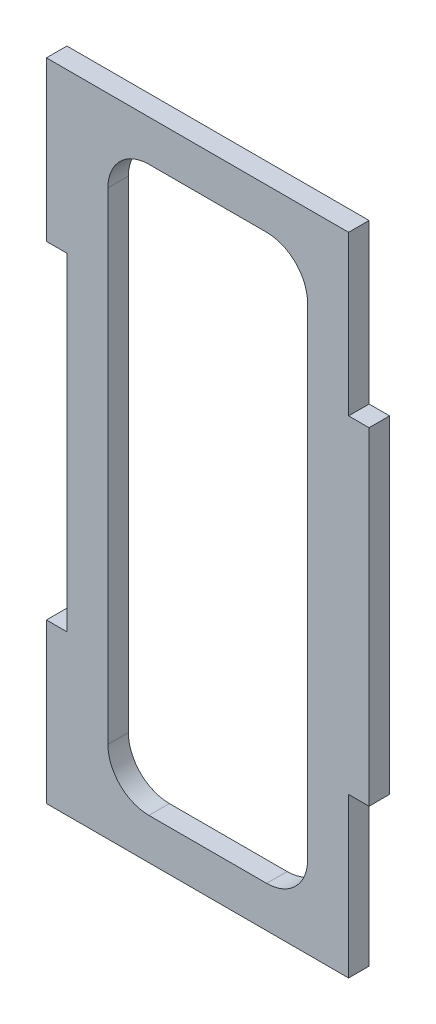
ISO-10303-21;
HEADER;
FILE_DESCRIPTION(('STEP AP214'),'2;1');
FILE_NAME('part.step','',(''),(''),'','','');
FILE_SCHEMA(('AUTOMOTIVE_DESIGN { 1 0 10303 214 1 1 1 1 }'));
ENDSEC;
DATA;
#1=APPLICATION_CONTEXT('core data for automotive mechanical design processes');
#2=APPLICATION_PROTOCOL_DEFINITION('international standard','automotive_design',2000,#1);
#3=PRODUCT_CONTEXT('',#1,'mechanical');
#4=PRODUCT('Part','Part','',(#3));
#5=PRODUCT_RELATED_PRODUCT_CATEGORY('part','',(#4));
#6=PRODUCT_DEFINITION_FORMATION('','',#4);
#7=PRODUCT_DEFINITION_CONTEXT('part definition',#1,'design');
#8=PRODUCT_DEFINITION('design','',#6,#7);
#9=PRODUCT_DEFINITION_SHAPE('','',#8);
#10=(LENGTH_UNIT() NAMED_UNIT(*) SI_UNIT(.MILLI.,.METRE.));
#11=(NAMED_UNIT(*) PLANE_ANGLE_UNIT() SI_UNIT($,.RADIAN.));
#12=(NAMED_UNIT(*) SI_UNIT($,.STERADIAN.) SOLID_ANGLE_UNIT());
#13=UNCERTAINTY_MEASURE_WITH_UNIT(LENGTH_MEASURE(1.E-05),#10,'distance_accuracy_value','');
#14=(GEOMETRIC_REPRESENTATION_CONTEXT(3) GLOBAL_UNCERTAINTY_ASSIGNED_CONTEXT((#13)) GLOBAL_UNIT_ASSIGNED_CONTEXT((#10,
#11,#12)) REPRESENTATION_CONTEXT('',''));
#15=CARTESIAN_POINT('',(0.,0.,0.));
#16=DIRECTION('',(0.,0.,1.));
#17=DIRECTION('',(1.,0.,0.));
#18=AXIS2_PLACEMENT_3D('',#15,#16,#17);
#19=CARTESIAN_POINT('',(0.,0.,6.35));
#20=DIRECTION('',(0.,0.,-1.));
#21=DIRECTION('',(-1.,0.,0.));
#22=AXIS2_PLACEMENT_3D('',#19,#20,#21);
#23=PLANE('',#22);
#24=DIRECTION('',(1.,0.,0.));
#25=VECTOR('',#24,1.);
#26=CARTESIAN_POINT('',(-30.95,-137.4518,6.35));
#27=LINE('',#26,#25);
#28=CARTESIAN_POINT('',(-18.25,-137.4518,6.35));
#29=VERTEX_POINT('',#28);
#30=CARTESIAN_POINT('',(18.25,-137.4518,6.35));
#31=VERTEX_POINT('',#30);
#32=EDGE_CURVE('E310',#29,#31,#27,.T.);
#33=ORIENTED_EDGE('',*,*,#32,.F.);
#34=CARTESIAN_POINT('',(-18.25,-124.7518,6.35));
#35=DIRECTION('',(0.,0.,-1.));
#36=DIRECTION('',(-1.,0.,0.));
#37=AXIS2_PLACEMENT_3D('',#34,#35,#36);
#38=CIRCLE('',#37,12.7);
#39=CARTESIAN_POINT('',(-30.95,-124.7518,6.35));
#40=VERTEX_POINT('',#39);
#41=EDGE_CURVE('E40',#29,#40,#38,.T.);
#42=ORIENTED_EDGE('',*,*,#41,.T.);
#43=DIRECTION('',(0.,-1.,0.));
#44=VECTOR('',#43,1.);
#45=CARTESIAN_POINT('',(-30.95,-137.4518,6.35));
#46=LINE('',#45,#44);
#47=CARTESIAN_POINT('',(-30.95,24.6,6.35));
#48=VERTEX_POINT('',#47);
#49=EDGE_CURVE('E308',#48,#40,#46,.T.);
#50=ORIENTED_EDGE('',*,*,#49,.F.);
#51=CARTESIAN_POINT('',(-18.25,24.6,6.35));
#52=DIRECTION('',(0.,0.,-1.));
#53=DIRECTION('',(-1.,0.,0.));
#54=AXIS2_PLACEMENT_3D('',#51,#52,#53);
#55=CIRCLE('',#54,12.7);
#56=CARTESIAN_POINT('',(-18.25,37.3,6.35));
#57=VERTEX_POINT('',#56);
#58=EDGE_CURVE('E302',#48,#57,#55,.T.);
#59=ORIENTED_EDGE('',*,*,#58,.T.);
#60=DIRECTION('',(-1.,0.,0.));
#61=VECTOR('',#60,1.);
#62=CARTESIAN_POINT('',(-30.95,37.3,6.35));
#63=LINE('',#62,#61);
#64=CARTESIAN_POINT('',(18.25,37.3,6.35));
#65=VERTEX_POINT('',#64);
#66=EDGE_CURVE('E197',#65,#57,#63,.T.);
#67=ORIENTED_EDGE('',*,*,#66,.F.);
#68=CARTESIAN_POINT('',(18.25,24.6,6.35));
#69=DIRECTION('',(0.,0.,-1.));
#70=DIRECTION('',(-1.,0.,0.));
#71=AXIS2_PLACEMENT_3D('',#68,#69,#70);
#72=CIRCLE('',#71,12.7);
#73=CARTESIAN_POINT('',(30.9499999999999,24.6,6.35));
#74=VERTEX_POINT('',#73);
#75=EDGE_CURVE('E298',#65,#74,#72,.T.);
#76=ORIENTED_EDGE('',*,*,#75,.T.);
#77=DIRECTION('',(0.,1.,0.));
#78=VECTOR('',#77,1.);
#79=CARTESIAN_POINT('',(30.9499999999999,-137.4518,6.35));
#80=LINE('',#79,#78);
#81=CARTESIAN_POINT('',(30.9499999999999,-124.7518,6.35));
#82=VERTEX_POINT('',#81);
#83=EDGE_CURVE('E332',#82,#74,#80,.T.);
#84=ORIENTED_EDGE('',*,*,#83,.F.);
#85=CARTESIAN_POINT('',(18.25,-124.7518,6.35));
#86=DIRECTION('',(0.,0.,-1.));
#87=DIRECTION('',(-1.,0.,0.));
#88=AXIS2_PLACEMENT_3D('',#85,#86,#87);
#89=CIRCLE('',#88,12.7);
#90=EDGE_CURVE('E294',#82,#31,#89,.T.);
#91=ORIENTED_EDGE('',*,*,#90,.T.);
#92=EDGE_LOOP('',(#33,#42,#50,#59,#67,#76,#84,#91));
#93=FACE_BOUND('',#92,.T.);
#94=DIRECTION('',(1.,0.,0.));
#95=VECTOR('',#94,1.);
#96=CARTESIAN_POINT('',(0.,-100.8759,6.35));
#97=LINE('',#96,#95);
#98=CARTESIAN_POINT('',(43.65,-100.8759,6.35));
#99=VERTEX_POINT('',#98);
#100=CARTESIAN_POINT('',(50.,-100.8759,6.35));
#101=VERTEX_POINT('',#100);
#102=EDGE_CURVE('E186',#99,#101,#97,.T.);
#103=ORIENTED_EDGE('',*,*,#102,.T.);
#104=DIRECTION('',(0.,1.,0.));
#105=VECTOR('',#104,1.);
#106=CARTESIAN_POINT('',(50.,-150.1518,6.35));
#107=LINE('',#106,#105);
#108=CARTESIAN_POINT('',(50.,0.724099999999998,6.35));
#109=VERTEX_POINT('',#108);
#110=EDGE_CURVE('E257',#101,#109,#107,.T.);
#111=ORIENTED_EDGE('',*,*,#110,.T.);
#112=DIRECTION('',(1.,0.,0.));
#113=VECTOR('',#112,1.);
#114=CARTESIAN_POINT('',(0.,0.724099999999998,6.35));
#115=LINE('',#114,#113);
#116=CARTESIAN_POINT('',(43.65,0.724099999999998,6.35));
#117=VERTEX_POINT('',#116);
#118=EDGE_CURVE('E210',#117,#109,#115,.T.);
#119=ORIENTED_EDGE('',*,*,#118,.F.);
#120=DIRECTION('',(0.,-1.,0.));
#121=VECTOR('',#120,1.);
#122=CARTESIAN_POINT('',(43.65,0.,6.35));
#123=LINE('',#122,#121);
#124=CARTESIAN_POINT('',(43.65,50.,6.35));
#125=VERTEX_POINT('',#124);
#126=EDGE_CURVE('E204',#125,#117,#123,.T.);
#127=ORIENTED_EDGE('',*,*,#126,.F.);
#128=DIRECTION('',(-1.,0.,0.));
#129=VECTOR('',#128,1.);
#130=CARTESIAN_POINT('',(-50.,50.,6.35));
#131=LINE('',#130,#129);
#132=CARTESIAN_POINT('',(-50.,50.,6.35));
#133=VERTEX_POINT('',#132);
#134=EDGE_CURVE('E259',#125,#133,#131,.T.);
#135=ORIENTED_EDGE('',*,*,#134,.T.);
#136=DIRECTION('',(0.,-1.,0.));
#137=VECTOR('',#136,1.);
#138=CARTESIAN_POINT('',(-50.,-150.1518,6.35));
#139=LINE('',#138,#137);
#140=CARTESIAN_POINT('',(-50.,0.724100000000005,6.35));
#141=VERTEX_POINT('',#140);
#142=EDGE_CURVE('E250',#133,#141,#139,.T.);
#143=ORIENTED_EDGE('',*,*,#142,.T.);
#144=DIRECTION('',(1.,0.,0.));
#145=VECTOR('',#144,1.);
#146=CARTESIAN_POINT('',(0.,0.724100000000005,6.35));
#147=LINE('',#146,#145);
#148=CARTESIAN_POINT('',(-43.65,0.724100000000005,6.35));
#149=VERTEX_POINT('',#148);
#150=EDGE_CURVE('E228',#141,#149,#147,.T.);
#151=ORIENTED_EDGE('',*,*,#150,.T.);
#152=DIRECTION('',(0.,1.,0.));
#153=VECTOR('',#152,1.);
#154=CARTESIAN_POINT('',(-43.65,0.,6.35));
#155=LINE('',#154,#153);
#156=CARTESIAN_POINT('',(-43.65,-100.8759,6.35));
#157=VERTEX_POINT('',#156);
#158=EDGE_CURVE('E236',#157,#149,#155,.T.);
#159=ORIENTED_EDGE('',*,*,#158,.F.);
#160=DIRECTION('',(1.,0.,0.));
#161=VECTOR('',#160,1.);
#162=CARTESIAN_POINT('',(0.,-100.8759,6.35));
#163=LINE('',#162,#161);
#164=CARTESIAN_POINT('',(-50.,-100.8759,6.35));
#165=VERTEX_POINT('',#164);
#166=EDGE_CURVE('E219',#165,#157,#163,.T.);
#167=ORIENTED_EDGE('',*,*,#166,.F.);
#168=CARTESIAN_POINT('',(-50.,-150.1518,6.35));
#169=VERTEX_POINT('',#168);
#170=EDGE_CURVE('E254',#165,#169,#139,.T.);
#171=ORIENTED_EDGE('',*,*,#170,.T.);
#172=DIRECTION('',(1.,0.,0.));
#173=VECTOR('',#172,1.);
#174=CARTESIAN_POINT('',(-50.,-150.1518,6.35));
#175=LINE('',#174,#173);
#176=CARTESIAN_POINT('',(43.65,-150.1518,6.35));
#177=VERTEX_POINT('',#176);
#178=EDGE_CURVE('E253',#169,#177,#175,.T.);
#179=ORIENTED_EDGE('',*,*,#178,.T.);
#180=DIRECTION('',(0.,1.,0.));
#181=VECTOR('',#180,1.);
#182=CARTESIAN_POINT('',(43.65,0.,6.35));
#183=LINE('',#182,#181);
#184=EDGE_CURVE('E193',#177,#99,#183,.T.);
#185=ORIENTED_EDGE('',*,*,#184,.T.);
#186=EDGE_LOOP('',(#103,#111,#119,#127,#135,#143,#151,#159,#167,#171,#179,#185));
#187=FACE_BOUND('',#186,.T.);
#188=ADVANCED_FACE('F32',(#93,#187),#23,.F.);
#189=CARTESIAN_POINT('',(0.,0.,0.));
#190=DIRECTION('',(0.,0.,-1.));
#191=DIRECTION('',(-1.,0.,0.));
#192=AXIS2_PLACEMENT_3D('',#189,#190,#191);
#193=PLANE('',#192);
#194=DIRECTION('',(-1.,0.,0.));
#195=VECTOR('',#194,1.);
#196=CARTESIAN_POINT('',(-30.95,37.3,0.));
#197=LINE('',#196,#195);
#198=CARTESIAN_POINT('',(18.25,37.3,0.));
#199=VERTEX_POINT('',#198);
#200=CARTESIAN_POINT('',(-18.25,37.3,0.));
#201=VERTEX_POINT('',#200);
#202=EDGE_CURVE('E200',#199,#201,#197,.T.);
#203=ORIENTED_EDGE('',*,*,#202,.T.);
#204=CARTESIAN_POINT('',(-18.25,24.6,0.));
#205=DIRECTION('',(0.,0.,-1.));
#206=DIRECTION('',(-1.,0.,0.));
#207=AXIS2_PLACEMENT_3D('',#204,#205,#206);
#208=CIRCLE('',#207,12.7);
#209=CARTESIAN_POINT('',(-30.95,24.6,0.));
#210=VERTEX_POINT('',#209);
#211=EDGE_CURVE('E54',#201,#210,#208,.F.);
#212=ORIENTED_EDGE('',*,*,#211,.T.);
#213=DIRECTION('',(0.,-1.,0.));
#214=VECTOR('',#213,1.);
#215=CARTESIAN_POINT('',(-30.95,-137.4518,0.));
#216=LINE('',#215,#214);
#217=CARTESIAN_POINT('',(-30.95,-124.7518,0.));
#218=VERTEX_POINT('',#217);
#219=EDGE_CURVE('E321',#210,#218,#216,.T.);
#220=ORIENTED_EDGE('',*,*,#219,.T.);
#221=CARTESIAN_POINT('',(-18.25,-124.7518,0.));
#222=DIRECTION('',(0.,0.,-1.));
#223=DIRECTION('',(-1.,0.,0.));
#224=AXIS2_PLACEMENT_3D('',#221,#222,#223);
#225=CIRCLE('',#224,12.7);
#226=CARTESIAN_POINT('',(-18.25,-137.4518,0.));
#227=VERTEX_POINT('',#226);
#228=EDGE_CURVE('E11',#218,#227,#225,.F.);
#229=ORIENTED_EDGE('',*,*,#228,.T.);
#230=DIRECTION('',(1.,0.,0.));
#231=VECTOR('',#230,1.);
#232=CARTESIAN_POINT('',(-30.95,-137.4518,0.));
#233=LINE('',#232,#231);
#234=CARTESIAN_POINT('',(18.25,-137.4518,0.));
#235=VERTEX_POINT('',#234);
#236=EDGE_CURVE('E319',#227,#235,#233,.T.);
#237=ORIENTED_EDGE('',*,*,#236,.T.);
#238=CARTESIAN_POINT('',(18.25,-124.7518,0.));
#239=DIRECTION('',(0.,0.,-1.));
#240=DIRECTION('',(-1.,0.,0.));
#241=AXIS2_PLACEMENT_3D('',#238,#239,#240);
#242=CIRCLE('',#241,12.7);
#243=CARTESIAN_POINT('',(30.9499999999999,-124.7518,0.));
#244=VERTEX_POINT('',#243);
#245=EDGE_CURVE('E296',#235,#244,#242,.F.);
#246=ORIENTED_EDGE('',*,*,#245,.T.);
#247=DIRECTION('',(0.,1.,0.));
#248=VECTOR('',#247,1.);
#249=CARTESIAN_POINT('',(30.9499999999999,-137.4518,0.));
#250=LINE('',#249,#248);
#251=CARTESIAN_POINT('',(30.9499999999999,24.6,0.));
#252=VERTEX_POINT('',#251);
#253=EDGE_CURVE('E325',#244,#252,#250,.T.);
#254=ORIENTED_EDGE('',*,*,#253,.T.);
#255=CARTESIAN_POINT('',(18.25,24.6,0.));
#256=DIRECTION('',(0.,0.,-1.));
#257=DIRECTION('',(-1.,0.,0.));
#258=AXIS2_PLACEMENT_3D('',#255,#256,#257);
#259=CIRCLE('',#258,12.7);
#260=EDGE_CURVE('E300',#252,#199,#259,.F.);
#261=ORIENTED_EDGE('',*,*,#260,.T.);
#262=EDGE_LOOP('',(#203,#212,#220,#229,#237,#246,#254,#261));
#263=FACE_BOUND('',#262,.T.);
#264=DIRECTION('',(0.,1.,0.));
#265=VECTOR('',#264,1.);
#266=CARTESIAN_POINT('',(50.,-150.1518,0.));
#267=LINE('',#266,#265);
#268=CARTESIAN_POINT('',(50.,-100.8759,0.));
#269=VERTEX_POINT('',#268);
#270=CARTESIAN_POINT('',(50.,0.724099999999998,0.));
#271=VERTEX_POINT('',#270);
#272=EDGE_CURVE('E192',#269,#271,#267,.T.);
#273=ORIENTED_EDGE('',*,*,#272,.F.);
#274=DIRECTION('',(1.,0.,0.));
#275=VECTOR('',#274,1.);
#276=CARTESIAN_POINT('',(0.,-100.8759,0.));
#277=LINE('',#276,#275);
#278=CARTESIAN_POINT('',(43.65,-100.8759,0.));
#279=VERTEX_POINT('',#278);
#280=EDGE_CURVE('E180',#279,#269,#277,.T.);
#281=ORIENTED_EDGE('',*,*,#280,.F.);
#282=DIRECTION('',(0.,1.,0.));
#283=VECTOR('',#282,1.);
#284=CARTESIAN_POINT('',(43.65,0.,0.));
#285=LINE('',#284,#283);
#286=CARTESIAN_POINT('',(43.65,-150.1518,0.));
#287=VERTEX_POINT('',#286);
#288=EDGE_CURVE('E169',#287,#279,#285,.T.);
#289=ORIENTED_EDGE('',*,*,#288,.F.);
#290=DIRECTION('',(1.,0.,0.));
#291=VECTOR('',#290,1.);
#292=CARTESIAN_POINT('',(-50.,-150.1518,0.));
#293=LINE('',#292,#291);
#294=CARTESIAN_POINT('',(-50.,-150.1518,0.));
#295=VERTEX_POINT('',#294);
#296=EDGE_CURVE('E265',#295,#287,#293,.T.);
#297=ORIENTED_EDGE('',*,*,#296,.F.);
#298=DIRECTION('',(0.,-1.,0.));
#299=VECTOR('',#298,1.);
#300=CARTESIAN_POINT('',(-50.,-150.1518,0.));
#301=LINE('',#300,#299);
#302=CARTESIAN_POINT('',(-50.,-100.8759,0.));
#303=VERTEX_POINT('',#302);
#304=EDGE_CURVE('E244',#303,#295,#301,.T.);
#305=ORIENTED_EDGE('',*,*,#304,.F.);
#306=DIRECTION('',(1.,0.,0.));
#307=VECTOR('',#306,1.);
#308=CARTESIAN_POINT('',(0.,-100.8759,0.));
#309=LINE('',#308,#307);
#310=CARTESIAN_POINT('',(-43.65,-100.8759,0.));
#311=VERTEX_POINT('',#310);
#312=EDGE_CURVE('E224',#303,#311,#309,.T.);
#313=ORIENTED_EDGE('',*,*,#312,.T.);
#314=DIRECTION('',(0.,1.,0.));
#315=VECTOR('',#314,1.);
#316=CARTESIAN_POINT('',(-43.65,0.,0.));
#317=LINE('',#316,#315);
#318=CARTESIAN_POINT('',(-43.65,0.724100000000005,0.));
#319=VERTEX_POINT('',#318);
#320=EDGE_CURVE('E227',#311,#319,#317,.T.);
#321=ORIENTED_EDGE('',*,*,#320,.T.);
#322=DIRECTION('',(1.,0.,0.));
#323=VECTOR('',#322,1.);
#324=CARTESIAN_POINT('',(0.,0.724100000000005,0.));
#325=LINE('',#324,#323);
#326=CARTESIAN_POINT('',(-50.,0.724100000000005,0.));
#327=VERTEX_POINT('',#326);
#328=EDGE_CURVE('E231',#327,#319,#325,.T.);
#329=ORIENTED_EDGE('',*,*,#328,.F.);
#330=CARTESIAN_POINT('',(-50.,50.,0.));
#331=VERTEX_POINT('',#330);
#332=EDGE_CURVE('E262',#331,#327,#301,.T.);
#333=ORIENTED_EDGE('',*,*,#332,.F.);
#334=DIRECTION('',(-1.,0.,0.));
#335=VECTOR('',#334,1.);
#336=CARTESIAN_POINT('',(-50.,50.,0.));
#337=LINE('',#336,#335);
#338=CARTESIAN_POINT('',(43.65,50.,0.));
#339=VERTEX_POINT('',#338);
#340=EDGE_CURVE('E268',#339,#331,#337,.T.);
#341=ORIENTED_EDGE('',*,*,#340,.F.);
#342=DIRECTION('',(0.,-1.,0.));
#343=VECTOR('',#342,1.);
#344=CARTESIAN_POINT('',(43.65,0.,0.));
#345=LINE('',#344,#343);
#346=CARTESIAN_POINT('',(43.65,0.724099999999998,0.));
#347=VERTEX_POINT('',#346);
#348=EDGE_CURVE('E206',#339,#347,#345,.T.);
#349=ORIENTED_EDGE('',*,*,#348,.T.);
#350=DIRECTION('',(1.,0.,0.));
#351=VECTOR('',#350,1.);
#352=CARTESIAN_POINT('',(0.,0.724099999999998,0.));
#353=LINE('',#352,#351);
#354=EDGE_CURVE('E209',#347,#271,#353,.T.);
#355=ORIENTED_EDGE('',*,*,#354,.T.);
#356=EDGE_LOOP('',(#273,#281,#289,#297,#305,#313,#321,#329,#333,#341,#349,#355));
#357=FACE_BOUND('',#356,.T.);
#358=ADVANCED_FACE('F190',(#263,#357),#193,.T.);
#359=CARTESIAN_POINT('',(-50.,-150.1518,6.35));
#360=DIRECTION('',(0.,1.,0.));
#361=DIRECTION('',(0.,0.,1.));
#362=AXIS2_PLACEMENT_3D('',#359,#360,#361);
#363=PLANE('',#362);
#364=DIRECTION('',(0.,0.,1.));
#365=VECTOR('',#364,1.);
#366=CARTESIAN_POINT('',(43.65,-150.1518,0.));
#367=LINE('',#366,#365);
#368=EDGE_CURVE('E175',#287,#177,#367,.T.);
#369=ORIENTED_EDGE('',*,*,#368,.T.);
#370=ORIENTED_EDGE('',*,*,#178,.F.);
#371=DIRECTION('',(0.,0.,-1.));
#372=VECTOR('',#371,1.);
#373=CARTESIAN_POINT('',(-50.,-150.1518,6.35));
#374=LINE('',#373,#372);
#375=EDGE_CURVE('E272',#169,#295,#374,.T.);
#376=ORIENTED_EDGE('',*,*,#375,.T.);
#377=ORIENTED_EDGE('',*,*,#296,.T.);
#378=EDGE_LOOP('',(#369,#370,#376,#377));
#379=FACE_BOUND('',#378,.T.);
#380=ADVANCED_FACE('F360',(#379),#363,.F.);
#381=CARTESIAN_POINT('',(50.,-150.1518,6.35));
#382=DIRECTION('',(-1.,0.,0.));
#383=DIRECTION('',(0.,0.,1.));
#384=AXIS2_PLACEMENT_3D('',#381,#382,#383);
#385=PLANE('',#384);
#386=DIRECTION('',(0.,0.,1.));
#387=VECTOR('',#386,1.);
#388=CARTESIAN_POINT('',(50.,-100.8759,0.));
#389=LINE('',#388,#387);
#390=EDGE_CURVE('E202',#269,#101,#389,.T.);
#391=ORIENTED_EDGE('',*,*,#390,.F.);
#392=ORIENTED_EDGE('',*,*,#272,.T.);
#393=DIRECTION('',(0.,0.,1.));
#394=VECTOR('',#393,1.);
#395=CARTESIAN_POINT('',(50.,0.724099999999998,0.));
#396=LINE('',#395,#394);
#397=EDGE_CURVE('E220',#271,#109,#396,.T.);
#398=ORIENTED_EDGE('',*,*,#397,.T.);
#399=ORIENTED_EDGE('',*,*,#110,.F.);
#400=EDGE_LOOP('',(#391,#392,#398,#399));
#401=FACE_BOUND('',#400,.T.);
#402=ADVANCED_FACE('F372',(#401),#385,.F.);
#403=CARTESIAN_POINT('',(-50.,-150.1518,6.35));
#404=DIRECTION('',(1.,0.,0.));
#405=DIRECTION('',(0.,0.,-1.));
#406=AXIS2_PLACEMENT_3D('',#403,#404,#405);
#407=PLANE('',#406);
#408=DIRECTION('',(0.,0.,1.));
#409=VECTOR('',#408,1.);
#410=CARTESIAN_POINT('',(-50.,0.724100000000005,0.));
#411=LINE('',#410,#409);
#412=EDGE_CURVE('E241',#327,#141,#411,.T.);
#413=ORIENTED_EDGE('',*,*,#412,.T.);
#414=ORIENTED_EDGE('',*,*,#142,.F.);
#415=DIRECTION('',(0.,0.,-1.));
#416=VECTOR('',#415,1.);
#417=CARTESIAN_POINT('',(-50.,50.,6.35));
#418=LINE('',#417,#416);
#419=EDGE_CURVE('E261',#133,#331,#418,.T.);
#420=ORIENTED_EDGE('',*,*,#419,.T.);
#421=ORIENTED_EDGE('',*,*,#332,.T.);
#422=EDGE_LOOP('',(#413,#414,#420,#421));
#423=FACE_BOUND('',#422,.T.);
#424=ADVANCED_FACE('F375',(#423),#407,.F.);
#425=ORIENTED_EDGE('',*,*,#170,.F.);
#426=DIRECTION('',(0.,0.,1.));
#427=VECTOR('',#426,1.);
#428=CARTESIAN_POINT('',(-50.,-100.8759,0.));
#429=LINE('',#428,#427);
#430=EDGE_CURVE('E233',#303,#165,#429,.T.);
#431=ORIENTED_EDGE('',*,*,#430,.F.);
#432=ORIENTED_EDGE('',*,*,#304,.T.);
#433=ORIENTED_EDGE('',*,*,#375,.F.);
#434=EDGE_LOOP('',(#425,#431,#432,#433));
#435=FACE_BOUND('',#434,.T.);
#436=ADVANCED_FACE('F370',(#435),#407,.F.);
#437=CARTESIAN_POINT('',(-50.,50.,6.35));
#438=DIRECTION('',(0.,-1.,0.));
#439=DIRECTION('',(0.,0.,-1.));
#440=AXIS2_PLACEMENT_3D('',#437,#438,#439);
#441=PLANE('',#440);
#442=ORIENTED_EDGE('',*,*,#134,.F.);
#443=DIRECTION('',(0.,0.,1.));
#444=VECTOR('',#443,1.);
#445=CARTESIAN_POINT('',(43.65,50.,0.));
#446=LINE('',#445,#444);
#447=EDGE_CURVE('E217',#339,#125,#446,.T.);
#448=ORIENTED_EDGE('',*,*,#447,.F.);
#449=ORIENTED_EDGE('',*,*,#340,.T.);
#450=ORIENTED_EDGE('',*,*,#419,.F.);
#451=EDGE_LOOP('',(#442,#448,#449,#450));
#452=FACE_BOUND('',#451,.T.);
#453=ADVANCED_FACE('F366',(#452),#441,.F.);
#454=CARTESIAN_POINT('',(0.,0.724100000000005,0.));
#455=DIRECTION('',(0.,-1.,0.));
#456=DIRECTION('',(0.,0.,-1.));
#457=AXIS2_PLACEMENT_3D('',#454,#455,#456);
#458=PLANE('',#457);
#459=ORIENTED_EDGE('',*,*,#150,.F.);
#460=ORIENTED_EDGE('',*,*,#412,.F.);
#461=ORIENTED_EDGE('',*,*,#328,.T.);
#462=DIRECTION('',(0.,0.,1.));
#463=VECTOR('',#462,1.);
#464=CARTESIAN_POINT('',(-43.65,0.724100000000005,0.));
#465=LINE('',#464,#463);
#466=EDGE_CURVE('E245',#319,#149,#465,.T.);
#467=ORIENTED_EDGE('',*,*,#466,.T.);
#468=EDGE_LOOP('',(#459,#460,#461,#467));
#469=FACE_BOUND('',#468,.T.);
#470=ADVANCED_FACE('F369',(#469),#458,.T.);
#471=CARTESIAN_POINT('',(-43.65,0.,0.));
#472=DIRECTION('',(1.,0.,0.));
#473=DIRECTION('',(0.,0.,-1.));
#474=AXIS2_PLACEMENT_3D('',#471,#472,#473);
#475=PLANE('',#474);
#476=ORIENTED_EDGE('',*,*,#158,.T.);
#477=ORIENTED_EDGE('',*,*,#466,.F.);
#478=ORIENTED_EDGE('',*,*,#320,.F.);
#479=DIRECTION('',(0.,0.,1.));
#480=VECTOR('',#479,1.);
#481=CARTESIAN_POINT('',(-43.65,-100.8759,0.));
#482=LINE('',#481,#480);
#483=EDGE_CURVE('E247',#311,#157,#482,.T.);
#484=ORIENTED_EDGE('',*,*,#483,.T.);
#485=EDGE_LOOP('',(#476,#477,#478,#484));
#486=FACE_BOUND('',#485,.T.);
#487=ADVANCED_FACE('F415',(#486),#475,.F.);
#488=CARTESIAN_POINT('',(0.,-100.8759,0.));
#489=DIRECTION('',(0.,-1.,0.));
#490=DIRECTION('',(0.,0.,-1.));
#491=AXIS2_PLACEMENT_3D('',#488,#489,#490);
#492=PLANE('',#491);
#493=ORIENTED_EDGE('',*,*,#166,.T.);
#494=ORIENTED_EDGE('',*,*,#483,.F.);
#495=ORIENTED_EDGE('',*,*,#312,.F.);
#496=ORIENTED_EDGE('',*,*,#430,.T.);
#497=EDGE_LOOP('',(#493,#494,#495,#496));
#498=FACE_BOUND('',#497,.T.);
#499=ADVANCED_FACE('F363',(#498),#492,.F.);
#500=CARTESIAN_POINT('',(43.65,0.,0.));
#501=DIRECTION('',(-1.,0.,0.));
#502=DIRECTION('',(0.,-1.,0.));
#503=AXIS2_PLACEMENT_3D('',#500,#501,#502);
#504=PLANE('',#503);
#505=ORIENTED_EDGE('',*,*,#126,.T.);
#506=DIRECTION('',(0.,0.,1.));
#507=VECTOR('',#506,1.);
#508=CARTESIAN_POINT('',(43.65,0.724099999999998,0.));
#509=LINE('',#508,#507);
#510=EDGE_CURVE('E212',#347,#117,#509,.T.);
#511=ORIENTED_EDGE('',*,*,#510,.F.);
#512=ORIENTED_EDGE('',*,*,#348,.F.);
#513=ORIENTED_EDGE('',*,*,#447,.T.);
#514=EDGE_LOOP('',(#505,#511,#512,#513));
#515=FACE_BOUND('',#514,.T.);
#516=ADVANCED_FACE('F409',(#515),#504,.F.);
#517=CARTESIAN_POINT('',(0.,0.724099999999998,0.));
#518=DIRECTION('',(0.,-1.,0.));
#519=DIRECTION('',(0.,0.,-1.));
#520=AXIS2_PLACEMENT_3D('',#517,#518,#519);
#521=PLANE('',#520);
#522=ORIENTED_EDGE('',*,*,#118,.T.);
#523=ORIENTED_EDGE('',*,*,#397,.F.);
#524=ORIENTED_EDGE('',*,*,#354,.F.);
#525=ORIENTED_EDGE('',*,*,#510,.T.);
#526=EDGE_LOOP('',(#522,#523,#524,#525));
#527=FACE_BOUND('',#526,.T.);
#528=ADVANCED_FACE('F406',(#527),#521,.F.);
#529=CARTESIAN_POINT('',(0.,-100.8759,0.));
#530=DIRECTION('',(0.,-1.,0.));
#531=DIRECTION('',(0.,0.,-1.));
#532=AXIS2_PLACEMENT_3D('',#529,#530,#531);
#533=PLANE('',#532);
#534=ORIENTED_EDGE('',*,*,#102,.F.);
#535=DIRECTION('',(0.,0.,1.));
#536=VECTOR('',#535,1.);
#537=CARTESIAN_POINT('',(43.65,-100.8759,0.));
#538=LINE('',#537,#536);
#539=EDGE_CURVE('E172',#279,#99,#538,.T.);
#540=ORIENTED_EDGE('',*,*,#539,.F.);
#541=ORIENTED_EDGE('',*,*,#280,.T.);
#542=ORIENTED_EDGE('',*,*,#390,.T.);
#543=EDGE_LOOP('',(#534,#540,#541,#542));
#544=FACE_BOUND('',#543,.T.);
#545=ADVANCED_FACE('F183',(#544),#533,.T.);
#546=CARTESIAN_POINT('',(43.65,0.,0.));
#547=DIRECTION('',(1.,0.,0.));
#548=DIRECTION('',(0.,0.,-1.));
#549=AXIS2_PLACEMENT_3D('',#546,#547,#548);
#550=PLANE('',#549);
#551=ORIENTED_EDGE('',*,*,#184,.F.);
#552=ORIENTED_EDGE('',*,*,#368,.F.);
#553=ORIENTED_EDGE('',*,*,#288,.T.);
#554=ORIENTED_EDGE('',*,*,#539,.T.);
#555=EDGE_LOOP('',(#551,#552,#553,#554));
#556=FACE_BOUND('',#555,.T.);
#557=ADVANCED_FACE('F171',(#556),#550,.T.);
#558=CARTESIAN_POINT('',(-30.95,-137.4518,0.));
#559=DIRECTION('',(-1.,0.,0.));
#560=DIRECTION('',(0.,0.,1.));
#561=AXIS2_PLACEMENT_3D('',#558,#559,#560);
#562=PLANE('',#561);
#563=ORIENTED_EDGE('',*,*,#219,.F.);
#564=DIRECTION('',(0.,0.,1.));
#565=VECTOR('',#564,1.);
#566=CARTESIAN_POINT('',(-30.95,24.6,6.35));
#567=LINE('',#566,#565);
#568=EDGE_CURVE('E291',#210,#48,#567,.T.);
#569=ORIENTED_EDGE('',*,*,#568,.T.);
#570=ORIENTED_EDGE('',*,*,#49,.T.);
#571=DIRECTION('',(0.,0.,1.));
#572=VECTOR('',#571,1.);
#573=CARTESIAN_POINT('',(-30.95,-124.7518,0.));
#574=LINE('',#573,#572);
#575=EDGE_CURVE('E47',#40,#218,#574,.F.);
#576=ORIENTED_EDGE('',*,*,#575,.T.);
#577=EDGE_LOOP('',(#563,#569,#570,#576));
#578=FACE_BOUND('',#577,.T.);
#579=ADVANCED_FACE('F313',(#578),#562,.F.);
#580=CARTESIAN_POINT('',(-30.95,37.3,0.));
#581=DIRECTION('',(0.,1.,0.));
#582=DIRECTION('',(0.,0.,1.));
#583=AXIS2_PLACEMENT_3D('',#580,#581,#582);
#584=PLANE('',#583);
#585=ORIENTED_EDGE('',*,*,#202,.F.);
#586=DIRECTION('',(0.,0.,1.));
#587=VECTOR('',#586,1.);
#588=CARTESIAN_POINT('',(18.25,37.3,6.35));
#589=LINE('',#588,#587);
#590=EDGE_CURVE('E287',#199,#65,#589,.T.);
#591=ORIENTED_EDGE('',*,*,#590,.T.);
#592=ORIENTED_EDGE('',*,*,#66,.T.);
#593=DIRECTION('',(0.,0.,1.));
#594=VECTOR('',#593,1.);
#595=CARTESIAN_POINT('',(-18.25,37.3,0.));
#596=LINE('',#595,#594);
#597=EDGE_CURVE('E285',#57,#201,#596,.F.);
#598=ORIENTED_EDGE('',*,*,#597,.T.);
#599=EDGE_LOOP('',(#585,#591,#592,#598));
#600=FACE_BOUND('',#599,.T.);
#601=ADVANCED_FACE('F342',(#600),#584,.F.);
#602=CARTESIAN_POINT('',(30.9499999999999,-137.4518,0.));
#603=DIRECTION('',(1.,0.,0.));
#604=DIRECTION('',(0.,0.,-1.));
#605=AXIS2_PLACEMENT_3D('',#602,#603,#604);
#606=PLANE('',#605);
#607=ORIENTED_EDGE('',*,*,#253,.F.);
#608=DIRECTION('',(0.,0.,1.));
#609=VECTOR('',#608,1.);
#610=CARTESIAN_POINT('',(30.9499999999999,-124.7518,6.35));
#611=LINE('',#610,#609);
#612=EDGE_CURVE('E277',#244,#82,#611,.T.);
#613=ORIENTED_EDGE('',*,*,#612,.T.);
#614=ORIENTED_EDGE('',*,*,#83,.T.);
#615=DIRECTION('',(0.,0.,1.));
#616=VECTOR('',#615,1.);
#617=CARTESIAN_POINT('',(30.9499999999999,24.6,0.));
#618=LINE('',#617,#616);
#619=EDGE_CURVE('E275',#74,#252,#618,.F.);
#620=ORIENTED_EDGE('',*,*,#619,.T.);
#621=EDGE_LOOP('',(#607,#613,#614,#620));
#622=FACE_BOUND('',#621,.T.);
#623=ADVANCED_FACE('F388',(#622),#606,.F.);
#624=CARTESIAN_POINT('',(-30.95,-137.4518,0.));
#625=DIRECTION('',(0.,-1.,0.));
#626=DIRECTION('',(0.,0.,-1.));
#627=AXIS2_PLACEMENT_3D('',#624,#625,#626);
#628=PLANE('',#627);
#629=ORIENTED_EDGE('',*,*,#32,.T.);
#630=DIRECTION('',(0.,0.,1.));
#631=VECTOR('',#630,1.);
#632=CARTESIAN_POINT('',(18.25,-137.4518,0.));
#633=LINE('',#632,#631);
#634=EDGE_CURVE('E283',#31,#235,#633,.F.);
#635=ORIENTED_EDGE('',*,*,#634,.T.);
#636=ORIENTED_EDGE('',*,*,#236,.F.);
#637=DIRECTION('',(0.,0.,1.));
#638=VECTOR('',#637,1.);
#639=CARTESIAN_POINT('',(-18.25,-137.4518,6.35));
#640=LINE('',#639,#638);
#641=EDGE_CURVE('E280',#227,#29,#640,.T.);
#642=ORIENTED_EDGE('',*,*,#641,.T.);
#643=EDGE_LOOP('',(#629,#635,#636,#642));
#644=FACE_BOUND('',#643,.T.);
#645=ADVANCED_FACE('F323',(#644),#628,.F.);
#646=CARTESIAN_POINT('',(18.25,-124.7518,0.));
#647=DIRECTION('',(0.,0.,-1.));
#648=DIRECTION('',(-1.,0.,0.));
#649=AXIS2_PLACEMENT_3D('',#646,#647,#648);
#650=CYLINDRICAL_SURFACE('',#649,12.7);
#651=ORIENTED_EDGE('',*,*,#245,.F.);
#652=ORIENTED_EDGE('',*,*,#634,.F.);
#653=ORIENTED_EDGE('',*,*,#90,.F.);
#654=ORIENTED_EDGE('',*,*,#612,.F.);
#655=EDGE_LOOP('',(#651,#652,#653,#654));
#656=FACE_BOUND('',#655,.T.);
#657=ADVANCED_FACE('F352',(#656),#650,.F.);
#658=CARTESIAN_POINT('',(18.25,24.6,0.));
#659=DIRECTION('',(0.,0.,-1.));
#660=DIRECTION('',(-1.,0.,0.));
#661=AXIS2_PLACEMENT_3D('',#658,#659,#660);
#662=CYLINDRICAL_SURFACE('',#661,12.7);
#663=ORIENTED_EDGE('',*,*,#260,.F.);
#664=ORIENTED_EDGE('',*,*,#619,.F.);
#665=ORIENTED_EDGE('',*,*,#75,.F.);
#666=ORIENTED_EDGE('',*,*,#590,.F.);
#667=EDGE_LOOP('',(#663,#664,#665,#666));
#668=FACE_BOUND('',#667,.T.);
#669=ADVANCED_FACE('F347',(#668),#662,.F.);
#670=CARTESIAN_POINT('',(-18.25,24.6,0.));
#671=DIRECTION('',(0.,0.,-1.));
#672=DIRECTION('',(-1.,0.,0.));
#673=AXIS2_PLACEMENT_3D('',#670,#671,#672);
#674=CYLINDRICAL_SURFACE('',#673,12.7);
#675=ORIENTED_EDGE('',*,*,#211,.F.);
#676=ORIENTED_EDGE('',*,*,#597,.F.);
#677=ORIENTED_EDGE('',*,*,#58,.F.);
#678=ORIENTED_EDGE('',*,*,#568,.F.);
#679=EDGE_LOOP('',(#675,#676,#677,#678));
#680=FACE_BOUND('',#679,.T.);
#681=ADVANCED_FACE('F345',(#680),#674,.F.);
#682=CARTESIAN_POINT('',(-18.25,-124.7518,0.));
#683=DIRECTION('',(0.,0.,-1.));
#684=DIRECTION('',(-1.,0.,0.));
#685=AXIS2_PLACEMENT_3D('',#682,#683,#684);
#686=CYLINDRICAL_SURFACE('',#685,12.7);
#687=ORIENTED_EDGE('',*,*,#228,.F.);
#688=ORIENTED_EDGE('',*,*,#575,.F.);
#689=ORIENTED_EDGE('',*,*,#41,.F.);
#690=ORIENTED_EDGE('',*,*,#641,.F.);
#691=EDGE_LOOP('',(#687,#688,#689,#690));
#692=FACE_BOUND('',#691,.T.);
#693=ADVANCED_FACE('F34',(#692),#686,.F.);
#694=CLOSED_SHELL('',(#188,#358,#380,#402,#424,#436,#453,#470,#487,#499,#516,#528,#545,#557,
#579,#601,#623,#645,#657,#669,#681,#693));
#695=MANIFOLD_SOLID_BREP('B2',#694);
#696=ADVANCED_BREP_SHAPE_REPRESENTATION('',(#18,#695),#14);
#697=SHAPE_DEFINITION_REPRESENTATION(#9,#696);
ENDSEC;
END-ISO-10303-21;
